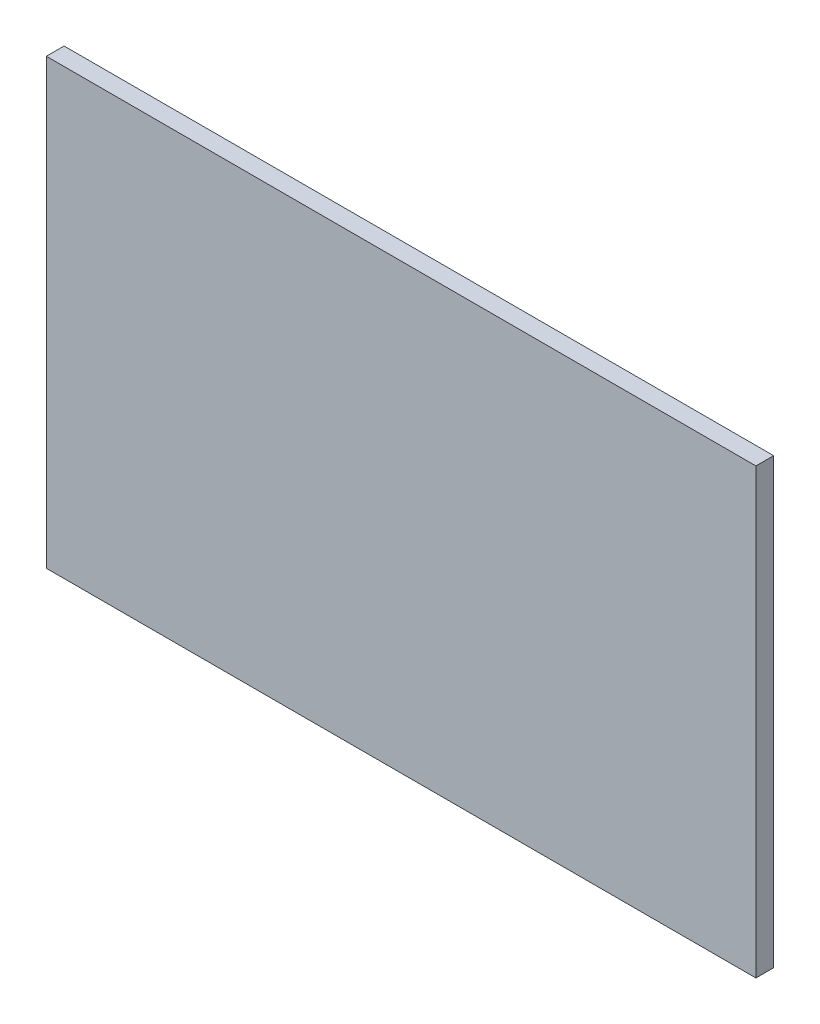
ISO-10303-21;
HEADER;
FILE_DESCRIPTION(('STEP AP214'),'2;1');
FILE_NAME('part.step','',(''),(''),'','','');
FILE_SCHEMA(('AUTOMOTIVE_DESIGN { 1 0 10303 214 1 1 1 1 }'));
ENDSEC;
DATA;
#1=APPLICATION_CONTEXT('core data for automotive mechanical design processes');
#2=APPLICATION_PROTOCOL_DEFINITION('international standard','automotive_design',2000,#1);
#3=PRODUCT_CONTEXT('',#1,'mechanical');
#4=PRODUCT('Part','Part','',(#3));
#5=PRODUCT_RELATED_PRODUCT_CATEGORY('part','',(#4));
#6=PRODUCT_DEFINITION_FORMATION('','',#4);
#7=PRODUCT_DEFINITION_CONTEXT('part definition',#1,'design');
#8=PRODUCT_DEFINITION('design','',#6,#7);
#9=PRODUCT_DEFINITION_SHAPE('','',#8);
#10=(LENGTH_UNIT() NAMED_UNIT(*) SI_UNIT(.MILLI.,.METRE.));
#11=(NAMED_UNIT(*) PLANE_ANGLE_UNIT() SI_UNIT($,.RADIAN.));
#12=(NAMED_UNIT(*) SI_UNIT($,.STERADIAN.) SOLID_ANGLE_UNIT());
#13=UNCERTAINTY_MEASURE_WITH_UNIT(LENGTH_MEASURE(1.E-05),#10,'distance_accuracy_value','');
#14=(GEOMETRIC_REPRESENTATION_CONTEXT(3) GLOBAL_UNCERTAINTY_ASSIGNED_CONTEXT((#13)) GLOBAL_UNIT_ASSIGNED_CONTEXT((#10,
#11,#12)) REPRESENTATION_CONTEXT('',''));
#15=CARTESIAN_POINT('',(0.,0.,0.));
#16=DIRECTION('',(0.,0.,1.));
#17=DIRECTION('',(1.,0.,0.));
#18=AXIS2_PLACEMENT_3D('',#15,#16,#17);
#19=CARTESIAN_POINT('',(-400.,-250.,20.));
#20=DIRECTION('',(1.,0.,0.));
#21=DIRECTION('',(0.,0.,-1.));
#22=AXIS2_PLACEMENT_3D('',#19,#20,#21);
#23=PLANE('',#22);
#24=DIRECTION('',(0.,-1.,0.));
#25=VECTOR('',#24,1.);
#26=CARTESIAN_POINT('',(-400.,-250.,0.));
#27=LINE('',#26,#25);
#28=CARTESIAN_POINT('',(-400.,250.,0.));
#29=VERTEX_POINT('',#28);
#30=CARTESIAN_POINT('',(-400.,-250.,0.));
#31=VERTEX_POINT('',#30);
#32=EDGE_CURVE('E113',#29,#31,#27,.T.);
#33=ORIENTED_EDGE('',*,*,#32,.T.);
#34=DIRECTION('',(0.,0.,-1.));
#35=VECTOR('',#34,1.);
#36=CARTESIAN_POINT('',(-400.,-250.,20.));
#37=LINE('',#36,#35);
#38=CARTESIAN_POINT('',(-400.,-250.,20.));
#39=VERTEX_POINT('',#38);
#40=EDGE_CURVE('E11',#39,#31,#37,.T.);
#41=ORIENTED_EDGE('',*,*,#40,.F.);
#42=DIRECTION('',(0.,-1.,0.));
#43=VECTOR('',#42,1.);
#44=CARTESIAN_POINT('',(-400.,-250.,20.));
#45=LINE('',#44,#43);
#46=CARTESIAN_POINT('',(-400.,250.,20.));
#47=VERTEX_POINT('',#46);
#48=EDGE_CURVE('E97',#47,#39,#45,.T.);
#49=ORIENTED_EDGE('',*,*,#48,.F.);
#50=DIRECTION('',(0.,0.,-1.));
#51=VECTOR('',#50,1.);
#52=CARTESIAN_POINT('',(-400.,250.,20.));
#53=LINE('',#52,#51);
#54=EDGE_CURVE('E109',#47,#29,#53,.T.);
#55=ORIENTED_EDGE('',*,*,#54,.T.);
#56=EDGE_LOOP('',(#33,#41,#49,#55));
#57=FACE_BOUND('',#56,.T.);
#58=ADVANCED_FACE('F45',(#57),#23,.F.);
#59=CARTESIAN_POINT('',(400.,-250.,20.));
#60=DIRECTION('',(0.,1.,0.));
#61=DIRECTION('',(-1.,0.,0.));
#62=AXIS2_PLACEMENT_3D('',#59,#60,#61);
#63=PLANE('',#62);
#64=DIRECTION('',(1.,0.,0.));
#65=VECTOR('',#64,1.);
#66=CARTESIAN_POINT('',(400.,-250.,0.));
#67=LINE('',#66,#65);
#68=CARTESIAN_POINT('',(400.,-250.,0.));
#69=VERTEX_POINT('',#68);
#70=EDGE_CURVE('E102',#31,#69,#67,.T.);
#71=ORIENTED_EDGE('',*,*,#70,.T.);
#72=DIRECTION('',(0.,0.,-1.));
#73=VECTOR('',#72,1.);
#74=CARTESIAN_POINT('',(400.,-250.,20.));
#75=LINE('',#74,#73);
#76=CARTESIAN_POINT('',(400.,-250.,20.));
#77=VERTEX_POINT('',#76);
#78=EDGE_CURVE('E54',#77,#69,#75,.T.);
#79=ORIENTED_EDGE('',*,*,#78,.F.);
#80=DIRECTION('',(1.,0.,0.));
#81=VECTOR('',#80,1.);
#82=CARTESIAN_POINT('',(400.,-250.,20.));
#83=LINE('',#82,#81);
#84=EDGE_CURVE('E92',#39,#77,#83,.T.);
#85=ORIENTED_EDGE('',*,*,#84,.F.);
#86=ORIENTED_EDGE('',*,*,#40,.T.);
#87=EDGE_LOOP('',(#71,#79,#85,#86));
#88=FACE_BOUND('',#87,.T.);
#89=ADVANCED_FACE('F101',(#88),#63,.F.);
#90=CARTESIAN_POINT('',(400.,-250.,20.));
#91=DIRECTION('',(-1.,0.,0.));
#92=DIRECTION('',(0.,0.,1.));
#93=AXIS2_PLACEMENT_3D('',#90,#91,#92);
#94=PLANE('',#93);
#95=DIRECTION('',(0.,1.,0.));
#96=VECTOR('',#95,1.);
#97=CARTESIAN_POINT('',(400.,-250.,0.));
#98=LINE('',#97,#96);
#99=CARTESIAN_POINT('',(400.,250.,0.));
#100=VERTEX_POINT('',#99);
#101=EDGE_CURVE('E79',#69,#100,#98,.T.);
#102=ORIENTED_EDGE('',*,*,#101,.T.);
#103=DIRECTION('',(0.,0.,-1.));
#104=VECTOR('',#103,1.);
#105=CARTESIAN_POINT('',(400.,250.,20.));
#106=LINE('',#105,#104);
#107=CARTESIAN_POINT('',(400.,250.,20.));
#108=VERTEX_POINT('',#107);
#109=EDGE_CURVE('E104',#108,#100,#106,.T.);
#110=ORIENTED_EDGE('',*,*,#109,.F.);
#111=DIRECTION('',(0.,1.,0.));
#112=VECTOR('',#111,1.);
#113=CARTESIAN_POINT('',(400.,-250.,20.));
#114=LINE('',#113,#112);
#115=EDGE_CURVE('E95',#77,#108,#114,.T.);
#116=ORIENTED_EDGE('',*,*,#115,.F.);
#117=ORIENTED_EDGE('',*,*,#78,.T.);
#118=EDGE_LOOP('',(#102,#110,#116,#117));
#119=FACE_BOUND('',#118,.T.);
#120=ADVANCED_FACE('F105',(#119),#94,.F.);
#121=CARTESIAN_POINT('',(400.,250.,20.));
#122=DIRECTION('',(0.,-1.,0.));
#123=DIRECTION('',(1.,0.,0.));
#124=AXIS2_PLACEMENT_3D('',#121,#122,#123);
#125=PLANE('',#124);
#126=DIRECTION('',(-1.,0.,0.));
#127=VECTOR('',#126,1.);
#128=CARTESIAN_POINT('',(400.,250.,0.));
#129=LINE('',#128,#127);
#130=EDGE_CURVE('E85',#100,#29,#129,.T.);
#131=ORIENTED_EDGE('',*,*,#130,.T.);
#132=ORIENTED_EDGE('',*,*,#54,.F.);
#133=DIRECTION('',(-1.,0.,0.));
#134=VECTOR('',#133,1.);
#135=CARTESIAN_POINT('',(400.,250.,20.));
#136=LINE('',#135,#134);
#137=EDGE_CURVE('E62',#108,#47,#136,.T.);
#138=ORIENTED_EDGE('',*,*,#137,.F.);
#139=ORIENTED_EDGE('',*,*,#109,.T.);
#140=EDGE_LOOP('',(#131,#132,#138,#139));
#141=FACE_BOUND('',#140,.T.);
#142=ADVANCED_FACE('F126',(#141),#125,.F.);
#143=CARTESIAN_POINT('',(0.,0.,20.));
#144=DIRECTION('',(0.,0.,1.));
#145=DIRECTION('',(1.,0.,0.));
#146=AXIS2_PLACEMENT_3D('',#143,#144,#145);
#147=PLANE('',#146);
#148=ORIENTED_EDGE('',*,*,#48,.T.);
#149=ORIENTED_EDGE('',*,*,#84,.T.);
#150=ORIENTED_EDGE('',*,*,#115,.T.);
#151=ORIENTED_EDGE('',*,*,#137,.T.);
#152=EDGE_LOOP('',(#148,#149,#150,#151));
#153=FACE_BOUND('',#152,.T.);
#154=ADVANCED_FACE('F93',(#153),#147,.T.);
#155=CARTESIAN_POINT('',(0.,0.,0.));
#156=DIRECTION('',(0.,0.,1.));
#157=DIRECTION('',(1.,0.,0.));
#158=AXIS2_PLACEMENT_3D('',#155,#156,#157);
#159=PLANE('',#158);
#160=ORIENTED_EDGE('',*,*,#32,.F.);
#161=ORIENTED_EDGE('',*,*,#130,.F.);
#162=ORIENTED_EDGE('',*,*,#101,.F.);
#163=ORIENTED_EDGE('',*,*,#70,.F.);
#164=EDGE_LOOP('',(#160,#161,#162,#163));
#165=FACE_BOUND('',#164,.T.);
#166=ADVANCED_FACE('F129',(#165),#159,.F.);
#167=CLOSED_SHELL('',(#58,#89,#120,#142,#154,#166));
#168=MANIFOLD_SOLID_BREP('B2',#167);
#169=ADVANCED_BREP_SHAPE_REPRESENTATION('',(#18,#168),#14);
#170=SHAPE_DEFINITION_REPRESENTATION(#9,#169);
ENDSEC;
END-ISO-10303-21;
